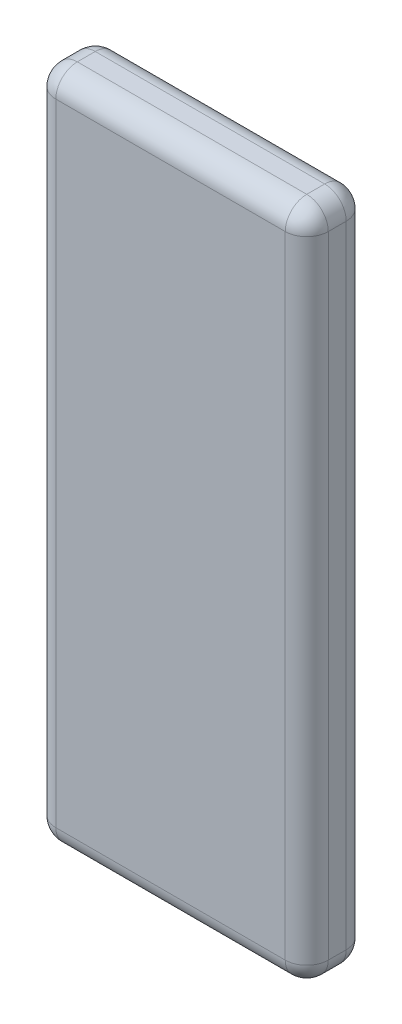
ISO-10303-21;
HEADER;
FILE_DESCRIPTION(('STEP AP214'),'2;1');
FILE_NAME('part.step','',(''),(''),'','','');
FILE_SCHEMA(('AUTOMOTIVE_DESIGN { 1 0 10303 214 1 1 1 1 }'));
ENDSEC;
DATA;
#1=APPLICATION_CONTEXT('core data for automotive mechanical design processes');
#2=APPLICATION_PROTOCOL_DEFINITION('international standard','automotive_design',2000,#1);
#3=PRODUCT_CONTEXT('',#1,'mechanical');
#4=PRODUCT('Part','Part','',(#3));
#5=PRODUCT_RELATED_PRODUCT_CATEGORY('part','',(#4));
#6=PRODUCT_DEFINITION_FORMATION('','',#4);
#7=PRODUCT_DEFINITION_CONTEXT('part definition',#1,'design');
#8=PRODUCT_DEFINITION('design','',#6,#7);
#9=PRODUCT_DEFINITION_SHAPE('','',#8);
#10=(LENGTH_UNIT() NAMED_UNIT(*) SI_UNIT(.MILLI.,.METRE.));
#11=(NAMED_UNIT(*) PLANE_ANGLE_UNIT() SI_UNIT($,.RADIAN.));
#12=(NAMED_UNIT(*) SI_UNIT($,.STERADIAN.) SOLID_ANGLE_UNIT());
#13=UNCERTAINTY_MEASURE_WITH_UNIT(LENGTH_MEASURE(1.E-05),#10,'distance_accuracy_value','');
#14=(GEOMETRIC_REPRESENTATION_CONTEXT(3) GLOBAL_UNCERTAINTY_ASSIGNED_CONTEXT((#13)) GLOBAL_UNIT_ASSIGNED_CONTEXT((#10,
#11,#12)) REPRESENTATION_CONTEXT('',''));
#15=CARTESIAN_POINT('',(0.,0.,0.));
#16=DIRECTION('',(0.,0.,1.));
#17=DIRECTION('',(1.,0.,0.));
#18=AXIS2_PLACEMENT_3D('',#15,#16,#17);
#19=CARTESIAN_POINT('',(-380.,-940.,85.));
#20=DIRECTION('',(-1.,0.,0.));
#21=DIRECTION('',(0.,0.,1.));
#22=AXIS2_PLACEMENT_3D('',#19,#20,#21);
#23=PLANE('',#22);
#24=DIRECTION('',(0.,0.,1.));
#25=VECTOR('',#24,1.);
#26=CARTESIAN_POINT('',(-380.,-880.,85.));
#27=LINE('',#26,#25);
#28=CARTESIAN_POINT('',(-380.,-880.,-25.));
#29=VERTEX_POINT('',#28);
#30=CARTESIAN_POINT('',(-380.,-880.,25.));
#31=VERTEX_POINT('',#30);
#32=EDGE_CURVE('E205',#29,#31,#27,.T.);
#33=ORIENTED_EDGE('',*,*,#32,.T.);
#34=DIRECTION('',(0.,1.,0.));
#35=VECTOR('',#34,1.);
#36=CARTESIAN_POINT('',(-380.,-940.,25.));
#37=LINE('',#36,#35);
#38=CARTESIAN_POINT('',(-380.,880.,25.));
#39=VERTEX_POINT('',#38);
#40=EDGE_CURVE('E212',#31,#39,#37,.T.);
#41=ORIENTED_EDGE('',*,*,#40,.T.);
#42=DIRECTION('',(0.,0.,1.));
#43=VECTOR('',#42,1.);
#44=CARTESIAN_POINT('',(-380.,880.,-85.));
#45=LINE('',#44,#43);
#46=CARTESIAN_POINT('',(-380.,880.,-25.));
#47=VERTEX_POINT('',#46);
#48=EDGE_CURVE('E208',#39,#47,#45,.F.);
#49=ORIENTED_EDGE('',*,*,#48,.T.);
#50=DIRECTION('',(0.,1.,0.));
#51=VECTOR('',#50,1.);
#52=CARTESIAN_POINT('',(-380.,-940.,-25.));
#53=LINE('',#52,#51);
#54=EDGE_CURVE('E202',#47,#29,#53,.F.);
#55=ORIENTED_EDGE('',*,*,#54,.T.);
#56=EDGE_LOOP('',(#33,#41,#49,#55));
#57=FACE_BOUND('',#56,.T.);
#58=ADVANCED_FACE('F41',(#57),#23,.T.);
#59=CARTESIAN_POINT('',(-380.,-940.,-85.));
#60=DIRECTION('',(0.,0.,-1.));
#61=DIRECTION('',(-1.,0.,0.));
#62=AXIS2_PLACEMENT_3D('',#59,#60,#61);
#63=PLANE('',#62);
#64=DIRECTION('',(0.,1.,0.));
#65=VECTOR('',#64,1.);
#66=CARTESIAN_POINT('',(-320.,-940.,-85.));
#67=LINE('',#66,#65);
#68=CARTESIAN_POINT('',(-320.,-880.,-85.));
#69=VERTEX_POINT('',#68);
#70=CARTESIAN_POINT('',(-320.,880.,-85.));
#71=VERTEX_POINT('',#70);
#72=EDGE_CURVE('E215',#69,#71,#67,.T.);
#73=ORIENTED_EDGE('',*,*,#72,.T.);
#74=DIRECTION('',(-1.,0.,0.));
#75=VECTOR('',#74,1.);
#76=CARTESIAN_POINT('',(380.,880.,-85.));
#77=LINE('',#76,#75);
#78=CARTESIAN_POINT('',(320.,880.,-85.));
#79=VERTEX_POINT('',#78);
#80=EDGE_CURVE('E224',#71,#79,#77,.F.);
#81=ORIENTED_EDGE('',*,*,#80,.T.);
#82=DIRECTION('',(0.,1.,0.));
#83=VECTOR('',#82,1.);
#84=CARTESIAN_POINT('',(320.,-940.,-85.));
#85=LINE('',#84,#83);
#86=CARTESIAN_POINT('',(320.,-880.,-85.));
#87=VERTEX_POINT('',#86);
#88=EDGE_CURVE('E221',#79,#87,#85,.F.);
#89=ORIENTED_EDGE('',*,*,#88,.T.);
#90=DIRECTION('',(-1.,0.,0.));
#91=VECTOR('',#90,1.);
#92=CARTESIAN_POINT('',(-380.,-880.,-85.));
#93=LINE('',#92,#91);
#94=EDGE_CURVE('E218',#87,#69,#93,.T.);
#95=ORIENTED_EDGE('',*,*,#94,.T.);
#96=EDGE_LOOP('',(#73,#81,#89,#95));
#97=FACE_BOUND('',#96,.T.);
#98=ADVANCED_FACE('F371',(#97),#63,.T.);
#99=CARTESIAN_POINT('',(380.,-940.,-85.));
#100=DIRECTION('',(1.,0.,0.));
#101=DIRECTION('',(0.,0.,-1.));
#102=AXIS2_PLACEMENT_3D('',#99,#100,#101);
#103=PLANE('',#102);
#104=DIRECTION('',(0.,1.,0.));
#105=VECTOR('',#104,1.);
#106=CARTESIAN_POINT('',(380.,-940.,-25.));
#107=LINE('',#106,#105);
#108=CARTESIAN_POINT('',(380.,-880.,-25.));
#109=VERTEX_POINT('',#108);
#110=CARTESIAN_POINT('',(380.,880.,-25.));
#111=VERTEX_POINT('',#110);
#112=EDGE_CURVE('E184',#109,#111,#107,.T.);
#113=ORIENTED_EDGE('',*,*,#112,.T.);
#114=DIRECTION('',(0.,0.,-1.));
#115=VECTOR('',#114,1.);
#116=CARTESIAN_POINT('',(380.,880.,85.));
#117=LINE('',#116,#115);
#118=CARTESIAN_POINT('',(380.,880.,25.));
#119=VERTEX_POINT('',#118);
#120=EDGE_CURVE('E141',#111,#119,#117,.F.);
#121=ORIENTED_EDGE('',*,*,#120,.T.);
#122=DIRECTION('',(0.,1.,0.));
#123=VECTOR('',#122,1.);
#124=CARTESIAN_POINT('',(380.,-940.,25.));
#125=LINE('',#124,#123);
#126=CARTESIAN_POINT('',(380.,-880.,25.));
#127=VERTEX_POINT('',#126);
#128=EDGE_CURVE('E177',#119,#127,#125,.F.);
#129=ORIENTED_EDGE('',*,*,#128,.T.);
#130=DIRECTION('',(0.,0.,-1.));
#131=VECTOR('',#130,1.);
#132=CARTESIAN_POINT('',(380.,-880.,-85.));
#133=LINE('',#132,#131);
#134=EDGE_CURVE('E173',#127,#109,#133,.T.);
#135=ORIENTED_EDGE('',*,*,#134,.T.);
#136=EDGE_LOOP('',(#113,#121,#129,#135));
#137=FACE_BOUND('',#136,.T.);
#138=ADVANCED_FACE('F367',(#137),#103,.T.);
#139=CARTESIAN_POINT('',(-380.,-940.,85.));
#140=DIRECTION('',(0.,0.,1.));
#141=DIRECTION('',(1.,0.,0.));
#142=AXIS2_PLACEMENT_3D('',#139,#140,#141);
#143=PLANE('',#142);
#144=DIRECTION('',(0.,1.,0.));
#145=VECTOR('',#144,1.);
#146=CARTESIAN_POINT('',(320.,-940.,85.));
#147=LINE('',#146,#145);
#148=CARTESIAN_POINT('',(320.,-880.,85.));
#149=VERTEX_POINT('',#148);
#150=CARTESIAN_POINT('',(320.,880.,85.));
#151=VERTEX_POINT('',#150);
#152=EDGE_CURVE('E195',#149,#151,#147,.T.);
#153=ORIENTED_EDGE('',*,*,#152,.T.);
#154=DIRECTION('',(1.,0.,0.));
#155=VECTOR('',#154,1.);
#156=CARTESIAN_POINT('',(-380.,880.,85.));
#157=LINE('',#156,#155);
#158=CARTESIAN_POINT('',(-320.,880.,85.));
#159=VERTEX_POINT('',#158);
#160=EDGE_CURVE('E198',#151,#159,#157,.F.);
#161=ORIENTED_EDGE('',*,*,#160,.T.);
#162=DIRECTION('',(0.,1.,0.));
#163=VECTOR('',#162,1.);
#164=CARTESIAN_POINT('',(-320.,-940.,85.));
#165=LINE('',#164,#163);
#166=CARTESIAN_POINT('',(-320.,-880.,85.));
#167=VERTEX_POINT('',#166);
#168=EDGE_CURVE('E189',#159,#167,#165,.F.);
#169=ORIENTED_EDGE('',*,*,#168,.T.);
#170=DIRECTION('',(1.,0.,0.));
#171=VECTOR('',#170,1.);
#172=CARTESIAN_POINT('',(-380.,-880.,85.));
#173=LINE('',#172,#171);
#174=EDGE_CURVE('E192',#167,#149,#173,.T.);
#175=ORIENTED_EDGE('',*,*,#174,.T.);
#176=EDGE_LOOP('',(#153,#161,#169,#175));
#177=FACE_BOUND('',#176,.T.);
#178=ADVANCED_FACE('F326',(#177),#143,.T.);
#179=CARTESIAN_POINT('',(0.,-940.,0.));
#180=DIRECTION('',(0.,-1.,0.));
#181=DIRECTION('',(0.,0.,-1.));
#182=AXIS2_PLACEMENT_3D('',#179,#180,#181);
#183=PLANE('',#182);
#184=DIRECTION('',(-1.,0.,0.));
#185=VECTOR('',#184,1.);
#186=CARTESIAN_POINT('',(0.,-940.,-25.));
#187=LINE('',#186,#185);
#188=CARTESIAN_POINT('',(-320.,-940.,-25.));
#189=VERTEX_POINT('',#188);
#190=CARTESIAN_POINT('',(320.,-940.,-25.));
#191=VERTEX_POINT('',#190);
#192=EDGE_CURVE('E51',#189,#191,#187,.F.);
#193=ORIENTED_EDGE('',*,*,#192,.T.);
#194=DIRECTION('',(0.,0.,-1.));
#195=VECTOR('',#194,1.);
#196=CARTESIAN_POINT('',(320.,-940.,0.));
#197=LINE('',#196,#195);
#198=CARTESIAN_POINT('',(320.,-940.,25.));
#199=VERTEX_POINT('',#198);
#200=EDGE_CURVE('E11',#191,#199,#197,.F.);
#201=ORIENTED_EDGE('',*,*,#200,.T.);
#202=DIRECTION('',(1.,0.,0.));
#203=VECTOR('',#202,1.);
#204=CARTESIAN_POINT('',(0.,-940.,25.));
#205=LINE('',#204,#203);
#206=CARTESIAN_POINT('',(-320.,-940.,25.));
#207=VERTEX_POINT('',#206);
#208=EDGE_CURVE('E231',#199,#207,#205,.F.);
#209=ORIENTED_EDGE('',*,*,#208,.T.);
#210=DIRECTION('',(0.,0.,1.));
#211=VECTOR('',#210,1.);
#212=CARTESIAN_POINT('',(-320.,-940.,0.));
#213=LINE('',#212,#211);
#214=EDGE_CURVE('E228',#207,#189,#213,.F.);
#215=ORIENTED_EDGE('',*,*,#214,.T.);
#216=EDGE_LOOP('',(#193,#201,#209,#215));
#217=FACE_BOUND('',#216,.T.);
#218=ADVANCED_FACE('F359',(#217),#183,.T.);
#219=CARTESIAN_POINT('',(0.,940.,0.));
#220=DIRECTION('',(0.,-1.,0.));
#221=DIRECTION('',(0.,0.,-1.));
#222=AXIS2_PLACEMENT_3D('',#219,#220,#221);
#223=PLANE('',#222);
#224=DIRECTION('',(1.,0.,0.));
#225=VECTOR('',#224,1.);
#226=CARTESIAN_POINT('',(380.,940.,25.));
#227=LINE('',#226,#225);
#228=CARTESIAN_POINT('',(-320.,940.,25.));
#229=VERTEX_POINT('',#228);
#230=CARTESIAN_POINT('',(320.,940.,25.));
#231=VERTEX_POINT('',#230);
#232=EDGE_CURVE('E170',#229,#231,#227,.T.);
#233=ORIENTED_EDGE('',*,*,#232,.T.);
#234=DIRECTION('',(0.,0.,-1.));
#235=VECTOR('',#234,1.);
#236=CARTESIAN_POINT('',(320.,940.,-85.));
#237=LINE('',#236,#235);
#238=CARTESIAN_POINT('',(320.,940.,-25.));
#239=VERTEX_POINT('',#238);
#240=EDGE_CURVE('E139',#231,#239,#237,.T.);
#241=ORIENTED_EDGE('',*,*,#240,.T.);
#242=DIRECTION('',(-1.,0.,0.));
#243=VECTOR('',#242,1.);
#244=CARTESIAN_POINT('',(-380.,940.,-25.));
#245=LINE('',#244,#243);
#246=CARTESIAN_POINT('',(-320.,940.,-25.));
#247=VERTEX_POINT('',#246);
#248=EDGE_CURVE('E159',#239,#247,#245,.T.);
#249=ORIENTED_EDGE('',*,*,#248,.T.);
#250=DIRECTION('',(0.,0.,1.));
#251=VECTOR('',#250,1.);
#252=CARTESIAN_POINT('',(-320.,940.,85.));
#253=LINE('',#252,#251);
#254=EDGE_CURVE('E166',#247,#229,#253,.T.);
#255=ORIENTED_EDGE('',*,*,#254,.T.);
#256=EDGE_LOOP('',(#233,#241,#249,#255));
#257=FACE_BOUND('',#256,.T.);
#258=ADVANCED_FACE('F168',(#257),#223,.F.);
#259=CARTESIAN_POINT('',(-320.,-880.,85.));
#260=DIRECTION('',(0.,0.,1.));
#261=DIRECTION('',(1.,0.,0.));
#262=AXIS2_PLACEMENT_3D('',#259,#260,#261);
#263=CYLINDRICAL_SURFACE('',#262,60.);
#264=CARTESIAN_POINT('',(-320.,-880.,25.));
#265=DIRECTION('',(0.,0.,1.));
#266=DIRECTION('',(1.,0.,0.));
#267=AXIS2_PLACEMENT_3D('',#264,#265,#266);
#268=CIRCLE('',#267,60.);
#269=EDGE_CURVE('E45',#31,#207,#268,.T.);
#270=ORIENTED_EDGE('',*,*,#269,.F.);
#271=ORIENTED_EDGE('',*,*,#32,.F.);
#272=CARTESIAN_POINT('',(-320.,-880.,-25.));
#273=DIRECTION('',(0.,0.,-1.));
#274=DIRECTION('',(-1.,0.,0.));
#275=AXIS2_PLACEMENT_3D('',#272,#273,#274);
#276=CIRCLE('',#275,60.);
#277=EDGE_CURVE('E303',#189,#29,#276,.T.);
#278=ORIENTED_EDGE('',*,*,#277,.F.);
#279=ORIENTED_EDGE('',*,*,#214,.F.);
#280=EDGE_LOOP('',(#270,#271,#278,#279));
#281=FACE_BOUND('',#280,.T.);
#282=ADVANCED_FACE('F43',(#281),#263,.T.);
#283=CARTESIAN_POINT('',(-320.,-880.,25.));
#284=DIRECTION('',(0.,0.,1.));
#285=DIRECTION('',(1.,0.,0.));
#286=AXIS2_PLACEMENT_3D('',#283,#284,#285);
#287=SPHERICAL_SURFACE('',#286,60.);
#288=CARTESIAN_POINT('',(-320.,-880.,25.));
#289=DIRECTION('',(0.,-1.,0.));
#290=DIRECTION('',(0.,0.,-1.));
#291=AXIS2_PLACEMENT_3D('',#288,#289,#290);
#292=CIRCLE('',#291,60.);
#293=EDGE_CURVE('E296',#31,#167,#292,.F.);
#294=ORIENTED_EDGE('',*,*,#293,.F.);
#295=ORIENTED_EDGE('',*,*,#269,.T.);
#296=CARTESIAN_POINT('',(-320.,-880.,25.));
#297=DIRECTION('',(-1.,0.,0.));
#298=DIRECTION('',(0.,0.,1.));
#299=AXIS2_PLACEMENT_3D('',#296,#297,#298);
#300=CIRCLE('',#299,60.);
#301=EDGE_CURVE('E300',#167,#207,#300,.F.);
#302=ORIENTED_EDGE('',*,*,#301,.F.);
#303=EDGE_LOOP('',(#294,#295,#302));
#304=FACE_BOUND('',#303,.T.);
#305=ADVANCED_FACE('F316',(#304),#287,.T.);
#306=CARTESIAN_POINT('',(-320.,-880.,-25.));
#307=DIRECTION('',(0.,0.,1.));
#308=DIRECTION('',(1.,0.,0.));
#309=AXIS2_PLACEMENT_3D('',#306,#307,#308);
#310=SPHERICAL_SURFACE('',#309,60.);
#311=CARTESIAN_POINT('',(-320.,-880.,-25.));
#312=DIRECTION('',(-1.,0.,0.));
#313=DIRECTION('',(0.,0.,1.));
#314=AXIS2_PLACEMENT_3D('',#311,#312,#313);
#315=CIRCLE('',#314,60.);
#316=EDGE_CURVE('E288',#189,#69,#315,.F.);
#317=ORIENTED_EDGE('',*,*,#316,.F.);
#318=ORIENTED_EDGE('',*,*,#277,.T.);
#319=CARTESIAN_POINT('',(-320.,-880.,-25.));
#320=DIRECTION('',(0.,-1.,0.));
#321=DIRECTION('',(0.,0.,-1.));
#322=AXIS2_PLACEMENT_3D('',#319,#320,#321);
#323=CIRCLE('',#322,60.);
#324=EDGE_CURVE('E292',#69,#29,#323,.F.);
#325=ORIENTED_EDGE('',*,*,#324,.F.);
#326=EDGE_LOOP('',(#317,#318,#325));
#327=FACE_BOUND('',#326,.T.);
#328=ADVANCED_FACE('F346',(#327),#310,.T.);
#329=CARTESIAN_POINT('',(-380.,-880.,25.));
#330=DIRECTION('',(1.,0.,0.));
#331=DIRECTION('',(0.,0.,-1.));
#332=AXIS2_PLACEMENT_3D('',#329,#330,#331);
#333=CYLINDRICAL_SURFACE('',#332,60.);
#334=ORIENTED_EDGE('',*,*,#301,.T.);
#335=ORIENTED_EDGE('',*,*,#208,.F.);
#336=CARTESIAN_POINT('',(320.,-880.,25.));
#337=DIRECTION('',(1.,0.,0.));
#338=DIRECTION('',(0.,1.,0.));
#339=AXIS2_PLACEMENT_3D('',#336,#337,#338);
#340=CIRCLE('',#339,60.);
#341=EDGE_CURVE('E65',#149,#199,#340,.T.);
#342=ORIENTED_EDGE('',*,*,#341,.F.);
#343=ORIENTED_EDGE('',*,*,#174,.F.);
#344=EDGE_LOOP('',(#334,#335,#342,#343));
#345=FACE_BOUND('',#344,.T.);
#346=ADVANCED_FACE('F324',(#345),#333,.T.);
#347=CARTESIAN_POINT('',(-320.,-940.,25.));
#348=DIRECTION('',(0.,1.,0.));
#349=DIRECTION('',(0.,0.,1.));
#350=AXIS2_PLACEMENT_3D('',#347,#348,#349);
#351=CYLINDRICAL_SURFACE('',#350,60.);
#352=ORIENTED_EDGE('',*,*,#293,.T.);
#353=ORIENTED_EDGE('',*,*,#168,.F.);
#354=CARTESIAN_POINT('',(-320.,880.,25.));
#355=DIRECTION('',(0.,1.,0.));
#356=DIRECTION('',(0.,0.,1.));
#357=AXIS2_PLACEMENT_3D('',#354,#355,#356);
#358=CIRCLE('',#357,60.);
#359=EDGE_CURVE('E279',#39,#159,#358,.T.);
#360=ORIENTED_EDGE('',*,*,#359,.F.);
#361=ORIENTED_EDGE('',*,*,#40,.F.);
#362=EDGE_LOOP('',(#352,#353,#360,#361));
#363=FACE_BOUND('',#362,.T.);
#364=ADVANCED_FACE('F332',(#363),#351,.T.);
#365=CARTESIAN_POINT('',(-320.,880.,0.));
#366=DIRECTION('',(0.,0.,-1.));
#367=DIRECTION('',(-1.,0.,0.));
#368=AXIS2_PLACEMENT_3D('',#365,#366,#367);
#369=CYLINDRICAL_SURFACE('',#368,60.);
#370=CARTESIAN_POINT('',(-320.,880.,-25.));
#371=DIRECTION('',(0.,0.,-1.));
#372=DIRECTION('',(-1.,0.,0.));
#373=AXIS2_PLACEMENT_3D('',#370,#371,#372);
#374=CIRCLE('',#373,60.);
#375=EDGE_CURVE('E271',#47,#247,#374,.T.);
#376=ORIENTED_EDGE('',*,*,#375,.F.);
#377=ORIENTED_EDGE('',*,*,#48,.F.);
#378=CARTESIAN_POINT('',(-320.,880.,25.));
#379=DIRECTION('',(0.,0.,1.));
#380=DIRECTION('',(1.,0.,0.));
#381=AXIS2_PLACEMENT_3D('',#378,#379,#380);
#382=CIRCLE('',#381,60.);
#383=EDGE_CURVE('E275',#229,#39,#382,.T.);
#384=ORIENTED_EDGE('',*,*,#383,.F.);
#385=ORIENTED_EDGE('',*,*,#254,.F.);
#386=EDGE_LOOP('',(#376,#377,#384,#385));
#387=FACE_BOUND('',#386,.T.);
#388=ADVANCED_FACE('F338',(#387),#369,.T.);
#389=CARTESIAN_POINT('',(-320.,-940.,-25.));
#390=DIRECTION('',(0.,1.,0.));
#391=DIRECTION('',(0.,0.,1.));
#392=AXIS2_PLACEMENT_3D('',#389,#390,#391);
#393=CYLINDRICAL_SURFACE('',#392,60.);
#394=ORIENTED_EDGE('',*,*,#324,.T.);
#395=ORIENTED_EDGE('',*,*,#54,.F.);
#396=CARTESIAN_POINT('',(-320.,880.,-25.));
#397=DIRECTION('',(0.,1.,0.));
#398=DIRECTION('',(0.,0.,1.));
#399=AXIS2_PLACEMENT_3D('',#396,#397,#398);
#400=CIRCLE('',#399,60.);
#401=EDGE_CURVE('E268',#71,#47,#400,.T.);
#402=ORIENTED_EDGE('',*,*,#401,.F.);
#403=ORIENTED_EDGE('',*,*,#72,.F.);
#404=EDGE_LOOP('',(#394,#395,#402,#403));
#405=FACE_BOUND('',#404,.T.);
#406=ADVANCED_FACE('F344',(#405),#393,.T.);
#407=CARTESIAN_POINT('',(-380.,-880.,-25.));
#408=DIRECTION('',(-1.,0.,0.));
#409=DIRECTION('',(0.,0.,1.));
#410=AXIS2_PLACEMENT_3D('',#407,#408,#409);
#411=CYLINDRICAL_SURFACE('',#410,60.);
#412=ORIENTED_EDGE('',*,*,#316,.T.);
#413=ORIENTED_EDGE('',*,*,#94,.F.);
#414=CARTESIAN_POINT('',(320.,-880.,-25.));
#415=DIRECTION('',(1.,0.,0.));
#416=DIRECTION('',(0.,0.,-1.));
#417=AXIS2_PLACEMENT_3D('',#414,#415,#416);
#418=CIRCLE('',#417,60.);
#419=EDGE_CURVE('E264',#191,#87,#418,.T.);
#420=ORIENTED_EDGE('',*,*,#419,.F.);
#421=ORIENTED_EDGE('',*,*,#192,.F.);
#422=EDGE_LOOP('',(#412,#413,#420,#421));
#423=FACE_BOUND('',#422,.T.);
#424=ADVANCED_FACE('F350',(#423),#411,.T.);
#425=CARTESIAN_POINT('',(320.,-880.,-85.));
#426=DIRECTION('',(0.,0.,-1.));
#427=DIRECTION('',(-1.,0.,0.));
#428=AXIS2_PLACEMENT_3D('',#425,#426,#427);
#429=CYLINDRICAL_SURFACE('',#428,60.);
#430=CARTESIAN_POINT('',(320.,-880.,25.));
#431=DIRECTION('',(0.,0.,1.));
#432=DIRECTION('',(1.,0.,0.));
#433=AXIS2_PLACEMENT_3D('',#430,#431,#432);
#434=CIRCLE('',#433,60.);
#435=EDGE_CURVE('E285',#199,#127,#434,.T.);
#436=ORIENTED_EDGE('',*,*,#435,.F.);
#437=ORIENTED_EDGE('',*,*,#200,.F.);
#438=CARTESIAN_POINT('',(320.,-880.,-25.));
#439=DIRECTION('',(0.,0.,-1.));
#440=DIRECTION('',(-1.,0.,0.));
#441=AXIS2_PLACEMENT_3D('',#438,#439,#440);
#442=CIRCLE('',#441,60.);
#443=EDGE_CURVE('E260',#109,#191,#442,.T.);
#444=ORIENTED_EDGE('',*,*,#443,.F.);
#445=ORIENTED_EDGE('',*,*,#134,.F.);
#446=EDGE_LOOP('',(#436,#437,#444,#445));
#447=FACE_BOUND('',#446,.T.);
#448=ADVANCED_FACE('F358',(#447),#429,.T.);
#449=CARTESIAN_POINT('',(320.,-880.,25.));
#450=DIRECTION('',(0.,0.,1.));
#451=DIRECTION('',(1.,0.,0.));
#452=AXIS2_PLACEMENT_3D('',#449,#450,#451);
#453=SPHERICAL_SURFACE('',#452,60.);
#454=ORIENTED_EDGE('',*,*,#341,.T.);
#455=ORIENTED_EDGE('',*,*,#435,.T.);
#456=CARTESIAN_POINT('',(320.,-880.,25.));
#457=DIRECTION('',(0.,-1.,0.));
#458=DIRECTION('',(0.,0.,-1.));
#459=AXIS2_PLACEMENT_3D('',#456,#457,#458);
#460=CIRCLE('',#459,60.);
#461=EDGE_CURVE('E256',#149,#127,#460,.F.);
#462=ORIENTED_EDGE('',*,*,#461,.F.);
#463=EDGE_LOOP('',(#454,#455,#462));
#464=FACE_BOUND('',#463,.T.);
#465=ADVANCED_FACE('F409',(#464),#453,.T.);
#466=CARTESIAN_POINT('',(-320.,880.,25.));
#467=DIRECTION('',(0.,0.,1.));
#468=DIRECTION('',(1.,0.,0.));
#469=AXIS2_PLACEMENT_3D('',#466,#467,#468);
#470=SPHERICAL_SURFACE('',#469,60.);
#471=ORIENTED_EDGE('',*,*,#383,.T.);
#472=ORIENTED_EDGE('',*,*,#359,.T.);
#473=CARTESIAN_POINT('',(-320.,880.,25.));
#474=DIRECTION('',(-1.,0.,0.));
#475=DIRECTION('',(0.,0.,1.));
#476=AXIS2_PLACEMENT_3D('',#473,#474,#475);
#477=CIRCLE('',#476,60.);
#478=EDGE_CURVE('E253',#229,#159,#477,.F.);
#479=ORIENTED_EDGE('',*,*,#478,.F.);
#480=EDGE_LOOP('',(#471,#472,#479));
#481=FACE_BOUND('',#480,.T.);
#482=ADVANCED_FACE('F406',(#481),#470,.T.);
#483=CARTESIAN_POINT('',(-320.,880.,-25.));
#484=DIRECTION('',(0.,0.,1.));
#485=DIRECTION('',(1.,0.,0.));
#486=AXIS2_PLACEMENT_3D('',#483,#484,#485);
#487=SPHERICAL_SURFACE('',#486,60.);
#488=ORIENTED_EDGE('',*,*,#401,.T.);
#489=ORIENTED_EDGE('',*,*,#375,.T.);
#490=CARTESIAN_POINT('',(-320.,880.,-25.));
#491=DIRECTION('',(-1.,0.,0.));
#492=DIRECTION('',(0.,0.,1.));
#493=AXIS2_PLACEMENT_3D('',#490,#491,#492);
#494=CIRCLE('',#493,60.);
#495=EDGE_CURVE('E162',#71,#247,#494,.F.);
#496=ORIENTED_EDGE('',*,*,#495,.F.);
#497=EDGE_LOOP('',(#488,#489,#496));
#498=FACE_BOUND('',#497,.T.);
#499=ADVANCED_FACE('F403',(#498),#487,.T.);
#500=CARTESIAN_POINT('',(320.,-880.,-25.));
#501=DIRECTION('',(0.,0.,1.));
#502=DIRECTION('',(1.,0.,0.));
#503=AXIS2_PLACEMENT_3D('',#500,#501,#502);
#504=SPHERICAL_SURFACE('',#503,60.);
#505=ORIENTED_EDGE('',*,*,#443,.T.);
#506=ORIENTED_EDGE('',*,*,#419,.T.);
#507=CARTESIAN_POINT('',(320.,-880.,-25.));
#508=DIRECTION('',(0.,-1.,0.));
#509=DIRECTION('',(0.,0.,-1.));
#510=AXIS2_PLACEMENT_3D('',#507,#508,#509);
#511=CIRCLE('',#510,60.);
#512=EDGE_CURVE('E247',#109,#87,#511,.F.);
#513=ORIENTED_EDGE('',*,*,#512,.F.);
#514=EDGE_LOOP('',(#505,#506,#513));
#515=FACE_BOUND('',#514,.T.);
#516=ADVANCED_FACE('F354',(#515),#504,.T.);
#517=CARTESIAN_POINT('',(320.,-940.,25.));
#518=DIRECTION('',(0.,1.,0.));
#519=DIRECTION('',(0.,0.,1.));
#520=AXIS2_PLACEMENT_3D('',#517,#518,#519);
#521=CYLINDRICAL_SURFACE('',#520,60.);
#522=ORIENTED_EDGE('',*,*,#461,.T.);
#523=ORIENTED_EDGE('',*,*,#128,.F.);
#524=CARTESIAN_POINT('',(320.,880.,25.));
#525=DIRECTION('',(0.,1.,0.));
#526=DIRECTION('',(0.,0.,1.));
#527=AXIS2_PLACEMENT_3D('',#524,#525,#526);
#528=CIRCLE('',#527,60.);
#529=EDGE_CURVE('E243',#151,#119,#528,.T.);
#530=ORIENTED_EDGE('',*,*,#529,.F.);
#531=ORIENTED_EDGE('',*,*,#152,.F.);
#532=EDGE_LOOP('',(#522,#523,#530,#531));
#533=FACE_BOUND('',#532,.T.);
#534=ADVANCED_FACE('F396',(#533),#521,.T.);
#535=CARTESIAN_POINT('',(0.,880.,25.));
#536=DIRECTION('',(-1.,0.,0.));
#537=DIRECTION('',(0.,0.,1.));
#538=AXIS2_PLACEMENT_3D('',#535,#536,#537);
#539=CYLINDRICAL_SURFACE('',#538,60.);
#540=ORIENTED_EDGE('',*,*,#478,.T.);
#541=ORIENTED_EDGE('',*,*,#160,.F.);
#542=CARTESIAN_POINT('',(320.,880.,25.));
#543=DIRECTION('',(1.,0.,0.));
#544=DIRECTION('',(0.,0.,-1.));
#545=AXIS2_PLACEMENT_3D('',#542,#543,#544);
#546=CIRCLE('',#545,60.);
#547=EDGE_CURVE('E156',#231,#151,#546,.T.);
#548=ORIENTED_EDGE('',*,*,#547,.F.);
#549=ORIENTED_EDGE('',*,*,#232,.F.);
#550=EDGE_LOOP('',(#540,#541,#548,#549));
#551=FACE_BOUND('',#550,.T.);
#552=ADVANCED_FACE('F393',(#551),#539,.T.);
#553=CARTESIAN_POINT('',(0.,880.,-25.));
#554=DIRECTION('',(1.,0.,0.));
#555=DIRECTION('',(0.,0.,-1.));
#556=AXIS2_PLACEMENT_3D('',#553,#554,#555);
#557=CYLINDRICAL_SURFACE('',#556,60.);
#558=ORIENTED_EDGE('',*,*,#495,.T.);
#559=ORIENTED_EDGE('',*,*,#248,.F.);
#560=CARTESIAN_POINT('',(320.,880.,-25.));
#561=DIRECTION('',(1.,0.,0.));
#562=DIRECTION('',(0.,0.,-1.));
#563=AXIS2_PLACEMENT_3D('',#560,#561,#562);
#564=CIRCLE('',#563,60.);
#565=EDGE_CURVE('E147',#79,#239,#564,.T.);
#566=ORIENTED_EDGE('',*,*,#565,.F.);
#567=ORIENTED_EDGE('',*,*,#80,.F.);
#568=EDGE_LOOP('',(#558,#559,#566,#567));
#569=FACE_BOUND('',#568,.T.);
#570=ADVANCED_FACE('F160',(#569),#557,.T.);
#571=CARTESIAN_POINT('',(320.,-940.,-25.));
#572=DIRECTION('',(0.,1.,0.));
#573=DIRECTION('',(0.,0.,1.));
#574=AXIS2_PLACEMENT_3D('',#571,#572,#573);
#575=CYLINDRICAL_SURFACE('',#574,60.);
#576=ORIENTED_EDGE('',*,*,#512,.T.);
#577=ORIENTED_EDGE('',*,*,#88,.F.);
#578=CARTESIAN_POINT('',(320.,880.,-25.));
#579=DIRECTION('',(0.,1.,0.));
#580=DIRECTION('',(0.,0.,1.));
#581=AXIS2_PLACEMENT_3D('',#578,#579,#580);
#582=CIRCLE('',#581,60.);
#583=EDGE_CURVE('E151',#111,#79,#582,.T.);
#584=ORIENTED_EDGE('',*,*,#583,.F.);
#585=ORIENTED_EDGE('',*,*,#112,.F.);
#586=EDGE_LOOP('',(#576,#577,#584,#585));
#587=FACE_BOUND('',#586,.T.);
#588=ADVANCED_FACE('F386',(#587),#575,.T.);
#589=CARTESIAN_POINT('',(320.,880.,25.));
#590=DIRECTION('',(0.,0.,1.));
#591=DIRECTION('',(1.,0.,0.));
#592=AXIS2_PLACEMENT_3D('',#589,#590,#591);
#593=SPHERICAL_SURFACE('',#592,60.);
#594=ORIENTED_EDGE('',*,*,#547,.T.);
#595=ORIENTED_EDGE('',*,*,#529,.T.);
#596=CARTESIAN_POINT('',(320.,880.,25.));
#597=DIRECTION('',(0.,0.,1.));
#598=DIRECTION('',(1.,0.,0.));
#599=AXIS2_PLACEMENT_3D('',#596,#597,#598);
#600=CIRCLE('',#599,60.);
#601=EDGE_CURVE('E144',#231,#119,#600,.F.);
#602=ORIENTED_EDGE('',*,*,#601,.F.);
#603=EDGE_LOOP('',(#594,#595,#602));
#604=FACE_BOUND('',#603,.T.);
#605=ADVANCED_FACE('F383',(#604),#593,.T.);
#606=CARTESIAN_POINT('',(320.,880.,-25.));
#607=DIRECTION('',(0.,0.,1.));
#608=DIRECTION('',(1.,0.,0.));
#609=AXIS2_PLACEMENT_3D('',#606,#607,#608);
#610=SPHERICAL_SURFACE('',#609,60.);
#611=ORIENTED_EDGE('',*,*,#583,.T.);
#612=ORIENTED_EDGE('',*,*,#565,.T.);
#613=CARTESIAN_POINT('',(320.,880.,-25.));
#614=DIRECTION('',(0.,0.,-1.));
#615=DIRECTION('',(-1.,0.,0.));
#616=AXIS2_PLACEMENT_3D('',#613,#614,#615);
#617=CIRCLE('',#616,60.);
#618=EDGE_CURVE('E135',#111,#239,#617,.F.);
#619=ORIENTED_EDGE('',*,*,#618,.F.);
#620=EDGE_LOOP('',(#611,#612,#619));
#621=FACE_BOUND('',#620,.T.);
#622=ADVANCED_FACE('F149',(#621),#610,.T.);
#623=CARTESIAN_POINT('',(320.,880.,0.));
#624=DIRECTION('',(0.,0.,1.));
#625=DIRECTION('',(1.,0.,0.));
#626=AXIS2_PLACEMENT_3D('',#623,#624,#625);
#627=CYLINDRICAL_SURFACE('',#626,60.);
#628=ORIENTED_EDGE('',*,*,#601,.T.);
#629=ORIENTED_EDGE('',*,*,#120,.F.);
#630=ORIENTED_EDGE('',*,*,#618,.T.);
#631=ORIENTED_EDGE('',*,*,#240,.F.);
#632=EDGE_LOOP('',(#628,#629,#630,#631));
#633=FACE_BOUND('',#632,.T.);
#634=ADVANCED_FACE('F137',(#633),#627,.T.);
#635=CLOSED_SHELL('',(#58,#98,#138,#178,#218,#258,#282,#305,#328,#346,#364,#388,#406,#424,#448,
#465,#482,#499,#516,#534,#552,#570,#588,#605,#622,#634));
#636=MANIFOLD_SOLID_BREP('B2',#635);
#637=ADVANCED_BREP_SHAPE_REPRESENTATION('',(#18,#636),#14);
#638=SHAPE_DEFINITION_REPRESENTATION(#9,#637);
ENDSEC;
END-ISO-10303-21;
